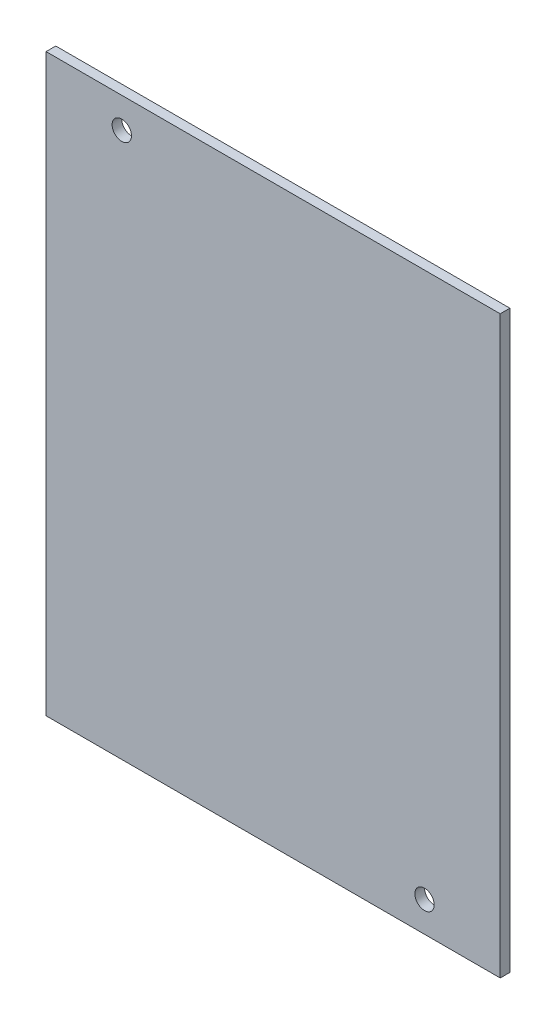
ISO-10303-21;
HEADER;
FILE_DESCRIPTION(('STEP AP214'),'2;1');
FILE_NAME('part.step','',(''),(''),'','','');
FILE_SCHEMA(('AUTOMOTIVE_DESIGN { 1 0 10303 214 1 1 1 1 }'));
ENDSEC;
DATA;
#1=APPLICATION_CONTEXT('core data for automotive mechanical design processes');
#2=APPLICATION_PROTOCOL_DEFINITION('international standard','automotive_design',2000,#1);
#3=PRODUCT_CONTEXT('',#1,'mechanical');
#4=PRODUCT('Part','Part','',(#3));
#5=PRODUCT_RELATED_PRODUCT_CATEGORY('part','',(#4));
#6=PRODUCT_DEFINITION_FORMATION('','',#4);
#7=PRODUCT_DEFINITION_CONTEXT('part definition',#1,'design');
#8=PRODUCT_DEFINITION('design','',#6,#7);
#9=PRODUCT_DEFINITION_SHAPE('','',#8);
#10=(LENGTH_UNIT() NAMED_UNIT(*) SI_UNIT(.MILLI.,.METRE.));
#11=(NAMED_UNIT(*) PLANE_ANGLE_UNIT() SI_UNIT($,.RADIAN.));
#12=(NAMED_UNIT(*) SI_UNIT($,.STERADIAN.) SOLID_ANGLE_UNIT());
#13=UNCERTAINTY_MEASURE_WITH_UNIT(LENGTH_MEASURE(1.E-05),#10,'distance_accuracy_value','');
#14=(GEOMETRIC_REPRESENTATION_CONTEXT(3) GLOBAL_UNCERTAINTY_ASSIGNED_CONTEXT((#13)) GLOBAL_UNIT_ASSIGNED_CONTEXT((#10,
#11,#12)) REPRESENTATION_CONTEXT('',''));
#15=CARTESIAN_POINT('',(0.,0.,0.));
#16=DIRECTION('',(0.,0.,1.));
#17=DIRECTION('',(1.,0.,0.));
#18=AXIS2_PLACEMENT_3D('',#15,#16,#17);
#19=CARTESIAN_POINT('',(0.,0.,1.6));
#20=DIRECTION('',(0.,0.,-1.));
#21=DIRECTION('',(-1.,0.,0.));
#22=AXIS2_PLACEMENT_3D('',#19,#20,#21);
#23=PLANE('',#22);
#24=DIRECTION('',(0.,1.,0.));
#25=VECTOR('',#24,1.);
#26=CARTESIAN_POINT('',(81.7,-100.400049502,1.6));
#27=LINE('',#26,#25);
#28=CARTESIAN_POINT('',(81.7,-100.400049502,1.6));
#29=VERTEX_POINT('',#28);
#30=CARTESIAN_POINT('',(81.7,-5.400049502,1.6));
#31=VERTEX_POINT('',#30);
#32=EDGE_CURVE('E84',#29,#31,#27,.T.);
#33=ORIENTED_EDGE('',*,*,#32,.T.);
#34=DIRECTION('',(-1.,0.,0.));
#35=VECTOR('',#34,1.);
#36=CARTESIAN_POINT('',(6.7,-5.400049502,1.6));
#37=LINE('',#36,#35);
#38=CARTESIAN_POINT('',(6.7,-5.400049502,1.6));
#39=VERTEX_POINT('',#38);
#40=EDGE_CURVE('E79',#31,#39,#37,.T.);
#41=ORIENTED_EDGE('',*,*,#40,.T.);
#42=DIRECTION('',(0.,-1.,0.));
#43=VECTOR('',#42,1.);
#44=CARTESIAN_POINT('',(6.7,-100.400049502,1.6));
#45=LINE('',#44,#43);
#46=CARTESIAN_POINT('',(6.7,-100.400049502,1.6));
#47=VERTEX_POINT('',#46);
#48=EDGE_CURVE('E82',#39,#47,#45,.T.);
#49=ORIENTED_EDGE('',*,*,#48,.T.);
#50=DIRECTION('',(1.,0.,0.));
#51=VECTOR('',#50,1.);
#52=CARTESIAN_POINT('',(6.7,-100.400049502,1.6));
#53=LINE('',#52,#51);
#54=EDGE_CURVE('E49',#47,#29,#53,.T.);
#55=ORIENTED_EDGE('',*,*,#54,.T.);
#56=EDGE_LOOP('',(#33,#41,#49,#55));
#57=FACE_BOUND('',#56,.T.);
#58=CARTESIAN_POINT('',(19.2,-10.400049502,1.6));
#59=DIRECTION('',(0.,0.,1.));
#60=DIRECTION('',(1.,0.,0.));
#61=AXIS2_PLACEMENT_3D('',#58,#59,#60);
#62=CIRCLE('',#61,1.60000000000159);
#63=CARTESIAN_POINT('',(20.8000000000016,-10.400049502,1.6));
#64=VERTEX_POINT('',#63);
#65=EDGE_CURVE('E99',#64,#64,#62,.T.);
#66=ORIENTED_EDGE('',*,*,#65,.F.);
#67=EDGE_LOOP('',(#66));
#68=FACE_BOUND('',#67,.T.);
#69=CARTESIAN_POINT('',(69.2,-95.400049502,1.6));
#70=DIRECTION('',(0.,0.,1.));
#71=DIRECTION('',(1.,0.,0.));
#72=AXIS2_PLACEMENT_3D('',#69,#70,#71);
#73=CIRCLE('',#72,1.60000000000121);
#74=CARTESIAN_POINT('',(70.8000000000012,-95.400049502,1.6));
#75=VERTEX_POINT('',#74);
#76=EDGE_CURVE('E114',#75,#75,#73,.T.);
#77=ORIENTED_EDGE('',*,*,#76,.F.);
#78=EDGE_LOOP('',(#77));
#79=FACE_BOUND('',#78,.T.);
#80=ADVANCED_FACE('F32',(#57,#68,#79),#23,.F.);
#81=CARTESIAN_POINT('',(0.,0.,0.));
#82=DIRECTION('',(0.,0.,-1.));
#83=DIRECTION('',(-1.,0.,0.));
#84=AXIS2_PLACEMENT_3D('',#81,#82,#83);
#85=PLANE('',#84);
#86=CARTESIAN_POINT('',(19.2,-10.400049502,0.));
#87=DIRECTION('',(0.,0.,1.));
#88=DIRECTION('',(1.,0.,0.));
#89=AXIS2_PLACEMENT_3D('',#86,#87,#88);
#90=CIRCLE('',#89,1.60000000000159);
#91=CARTESIAN_POINT('',(20.8000000000016,-10.400049502,0.));
#92=VERTEX_POINT('',#91);
#93=EDGE_CURVE('E111',#92,#92,#90,.T.);
#94=ORIENTED_EDGE('',*,*,#93,.T.);
#95=EDGE_LOOP('',(#94));
#96=FACE_BOUND('',#95,.T.);
#97=DIRECTION('',(0.,1.,0.));
#98=VECTOR('',#97,1.);
#99=CARTESIAN_POINT('',(81.7,-100.400049502,0.));
#100=LINE('',#99,#98);
#101=CARTESIAN_POINT('',(81.7,-100.400049502,0.));
#102=VERTEX_POINT('',#101);
#103=CARTESIAN_POINT('',(81.7,-5.400049502,0.));
#104=VERTEX_POINT('',#103);
#105=EDGE_CURVE('E96',#102,#104,#100,.T.);
#106=ORIENTED_EDGE('',*,*,#105,.F.);
#107=DIRECTION('',(1.,0.,0.));
#108=VECTOR('',#107,1.);
#109=CARTESIAN_POINT('',(6.7,-100.400049502,0.));
#110=LINE('',#109,#108);
#111=CARTESIAN_POINT('',(6.7,-100.400049502,0.));
#112=VERTEX_POINT('',#111);
#113=EDGE_CURVE('E72',#112,#102,#110,.T.);
#114=ORIENTED_EDGE('',*,*,#113,.F.);
#115=DIRECTION('',(0.,-1.,0.));
#116=VECTOR('',#115,1.);
#117=CARTESIAN_POINT('',(6.7,-100.400049502,0.));
#118=LINE('',#117,#116);
#119=CARTESIAN_POINT('',(6.7,-5.400049502,0.));
#120=VERTEX_POINT('',#119);
#121=EDGE_CURVE('E66',#120,#112,#118,.T.);
#122=ORIENTED_EDGE('',*,*,#121,.F.);
#123=DIRECTION('',(-1.,0.,0.));
#124=VECTOR('',#123,1.);
#125=CARTESIAN_POINT('',(6.7,-5.400049502,0.));
#126=LINE('',#125,#124);
#127=EDGE_CURVE('E88',#104,#120,#126,.T.);
#128=ORIENTED_EDGE('',*,*,#127,.F.);
#129=EDGE_LOOP('',(#106,#114,#122,#128));
#130=FACE_BOUND('',#129,.T.);
#131=CARTESIAN_POINT('',(69.2,-95.400049502,0.));
#132=DIRECTION('',(0.,0.,1.));
#133=DIRECTION('',(1.,0.,0.));
#134=AXIS2_PLACEMENT_3D('',#131,#132,#133);
#135=CIRCLE('',#134,1.60000000000121);
#136=CARTESIAN_POINT('',(70.8000000000012,-95.400049502,0.));
#137=VERTEX_POINT('',#136);
#138=EDGE_CURVE('E117',#137,#137,#135,.T.);
#139=ORIENTED_EDGE('',*,*,#138,.T.);
#140=EDGE_LOOP('',(#139));
#141=FACE_BOUND('',#140,.T.);
#142=ADVANCED_FACE('F107',(#96,#130,#141),#85,.T.);
#143=CARTESIAN_POINT('',(81.7,-100.400049502,1.6));
#144=DIRECTION('',(-1.,0.,0.));
#145=DIRECTION('',(0.,0.,1.));
#146=AXIS2_PLACEMENT_3D('',#143,#144,#145);
#147=PLANE('',#146);
#148=ORIENTED_EDGE('',*,*,#105,.T.);
#149=DIRECTION('',(0.,0.,-1.));
#150=VECTOR('',#149,1.);
#151=CARTESIAN_POINT('',(81.7,-5.400049502,1.6));
#152=LINE('',#151,#150);
#153=EDGE_CURVE('E11',#31,#104,#152,.T.);
#154=ORIENTED_EDGE('',*,*,#153,.F.);
#155=ORIENTED_EDGE('',*,*,#32,.F.);
#156=DIRECTION('',(0.,0.,-1.));
#157=VECTOR('',#156,1.);
#158=CARTESIAN_POINT('',(81.7,-100.400049502,1.6));
#159=LINE('',#158,#157);
#160=EDGE_CURVE('E92',#29,#102,#159,.T.);
#161=ORIENTED_EDGE('',*,*,#160,.T.);
#162=EDGE_LOOP('',(#148,#154,#155,#161));
#163=FACE_BOUND('',#162,.T.);
#164=ADVANCED_FACE('F34',(#163),#147,.F.);
#165=CARTESIAN_POINT('',(6.7,-5.400049502,1.6));
#166=DIRECTION('',(0.,-1.,0.));
#167=DIRECTION('',(0.,0.,-1.));
#168=AXIS2_PLACEMENT_3D('',#165,#166,#167);
#169=PLANE('',#168);
#170=ORIENTED_EDGE('',*,*,#127,.T.);
#171=DIRECTION('',(0.,0.,-1.));
#172=VECTOR('',#171,1.);
#173=CARTESIAN_POINT('',(6.7,-5.400049502,1.6));
#174=LINE('',#173,#172);
#175=EDGE_CURVE('E41',#39,#120,#174,.T.);
#176=ORIENTED_EDGE('',*,*,#175,.F.);
#177=ORIENTED_EDGE('',*,*,#40,.F.);
#178=ORIENTED_EDGE('',*,*,#153,.T.);
#179=EDGE_LOOP('',(#170,#176,#177,#178));
#180=FACE_BOUND('',#179,.T.);
#181=ADVANCED_FACE('F87',(#180),#169,.F.);
#182=CARTESIAN_POINT('',(6.7,-100.400049502,1.6));
#183=DIRECTION('',(1.,0.,0.));
#184=DIRECTION('',(0.,0.,-1.));
#185=AXIS2_PLACEMENT_3D('',#182,#183,#184);
#186=PLANE('',#185);
#187=ORIENTED_EDGE('',*,*,#121,.T.);
#188=DIRECTION('',(0.,0.,-1.));
#189=VECTOR('',#188,1.);
#190=CARTESIAN_POINT('',(6.7,-100.400049502,1.6));
#191=LINE('',#190,#189);
#192=EDGE_CURVE('E89',#47,#112,#191,.T.);
#193=ORIENTED_EDGE('',*,*,#192,.F.);
#194=ORIENTED_EDGE('',*,*,#48,.F.);
#195=ORIENTED_EDGE('',*,*,#175,.T.);
#196=EDGE_LOOP('',(#187,#193,#194,#195));
#197=FACE_BOUND('',#196,.T.);
#198=ADVANCED_FACE('F90',(#197),#186,.F.);
#199=CARTESIAN_POINT('',(6.7,-100.400049502,1.6));
#200=DIRECTION('',(0.,1.,0.));
#201=DIRECTION('',(0.,0.,1.));
#202=AXIS2_PLACEMENT_3D('',#199,#200,#201);
#203=PLANE('',#202);
#204=ORIENTED_EDGE('',*,*,#113,.T.);
#205=ORIENTED_EDGE('',*,*,#160,.F.);
#206=ORIENTED_EDGE('',*,*,#54,.F.);
#207=ORIENTED_EDGE('',*,*,#192,.T.);
#208=EDGE_LOOP('',(#204,#205,#206,#207));
#209=FACE_BOUND('',#208,.T.);
#210=ADVANCED_FACE('F104',(#209),#203,.F.);
#211=CARTESIAN_POINT('',(19.2,-10.400049502,1.6));
#212=DIRECTION('',(0.,0.,-1.));
#213=DIRECTION('',(-1.,0.,0.));
#214=AXIS2_PLACEMENT_3D('',#211,#212,#213);
#215=CYLINDRICAL_SURFACE('',#214,1.60000000000159);
#216=ORIENTED_EDGE('',*,*,#65,.T.);
#217=EDGE_LOOP('',(#216));
#218=FACE_BOUND('',#217,.T.);
#219=ORIENTED_EDGE('',*,*,#93,.F.);
#220=EDGE_LOOP('',(#219));
#221=FACE_BOUND('',#220,.T.);
#222=ADVANCED_FACE('F134',(#218,#221),#215,.F.);
#223=CARTESIAN_POINT('',(69.2,-95.400049502,1.6));
#224=DIRECTION('',(0.,0.,-1.));
#225=DIRECTION('',(-1.,0.,0.));
#226=AXIS2_PLACEMENT_3D('',#223,#224,#225);
#227=CYLINDRICAL_SURFACE('',#226,1.60000000000121);
#228=ORIENTED_EDGE('',*,*,#76,.T.);
#229=EDGE_LOOP('',(#228));
#230=FACE_BOUND('',#229,.T.);
#231=ORIENTED_EDGE('',*,*,#138,.F.);
#232=EDGE_LOOP('',(#231));
#233=FACE_BOUND('',#232,.T.);
#234=ADVANCED_FACE('F123',(#230,#233),#227,.F.);
#235=CLOSED_SHELL('',(#80,#142,#164,#181,#198,#210,#222,#234));
#236=MANIFOLD_SOLID_BREP('B2',#235);
#237=ADVANCED_BREP_SHAPE_REPRESENTATION('',(#18,#236),#14);
#238=SHAPE_DEFINITION_REPRESENTATION(#9,#237);
ENDSEC;
END-ISO-10303-21;
